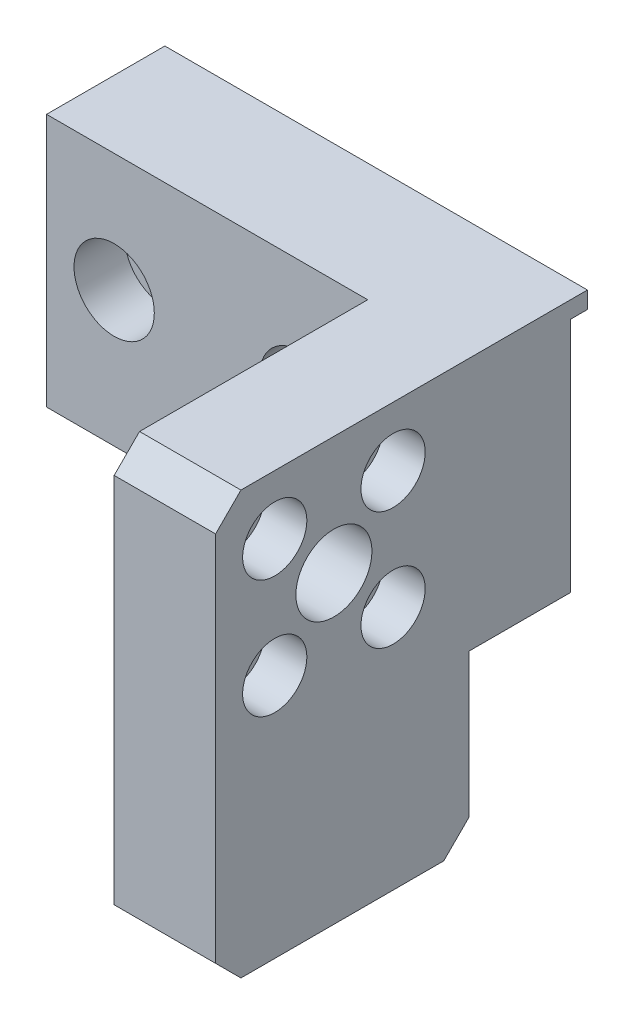
ISO-10303-21;
HEADER;
FILE_DESCRIPTION(('STEP AP214'),'2;1');
FILE_NAME('part.step','',(''),(''),'','','');
FILE_SCHEMA(('AUTOMOTIVE_DESIGN { 1 0 10303 214 1 1 1 1 }'));
ENDSEC;
DATA;
#1=APPLICATION_CONTEXT('core data for automotive mechanical design processes');
#2=APPLICATION_PROTOCOL_DEFINITION('international standard','automotive_design',2000,#1);
#3=PRODUCT_CONTEXT('',#1,'mechanical');
#4=PRODUCT('Part','Part','',(#3));
#5=PRODUCT_RELATED_PRODUCT_CATEGORY('part','',(#4));
#6=PRODUCT_DEFINITION_FORMATION('','',#4);
#7=PRODUCT_DEFINITION_CONTEXT('part definition',#1,'design');
#8=PRODUCT_DEFINITION('design','',#6,#7);
#9=PRODUCT_DEFINITION_SHAPE('','',#8);
#10=(LENGTH_UNIT() NAMED_UNIT(*) SI_UNIT(.MILLI.,.METRE.));
#11=(NAMED_UNIT(*) PLANE_ANGLE_UNIT() SI_UNIT($,.RADIAN.));
#12=(NAMED_UNIT(*) SI_UNIT($,.STERADIAN.) SOLID_ANGLE_UNIT());
#13=UNCERTAINTY_MEASURE_WITH_UNIT(LENGTH_MEASURE(1.E-05),#10,'distance_accuracy_value','');
#14=(GEOMETRIC_REPRESENTATION_CONTEXT(3) GLOBAL_UNCERTAINTY_ASSIGNED_CONTEXT((#13)) GLOBAL_UNIT_ASSIGNED_CONTEXT((#10,
#11,#12)) REPRESENTATION_CONTEXT('',''));
#15=CARTESIAN_POINT('',(0.,0.,0.));
#16=DIRECTION('',(0.,0.,1.));
#17=DIRECTION('',(1.,0.,0.));
#18=AXIS2_PLACEMENT_3D('',#15,#16,#17);
#19=CARTESIAN_POINT('',(13.,15.,44.));
#20=DIRECTION('',(1.,0.,0.));
#21=DIRECTION('',(0.,0.,-1.));
#22=AXIS2_PLACEMENT_3D('',#19,#20,#21);
#23=PLANE('',#22);
#24=CARTESIAN_POINT('',(13.,8.,23.));
#25=DIRECTION('',(1.,0.,0.));
#26=DIRECTION('',(0.,0.,-1.));
#27=AXIS2_PLACEMENT_3D('',#24,#25,#26);
#28=CIRCLE('',#27,2.25000000000001);
#29=CARTESIAN_POINT('',(13.,8.,20.75));
#30=VERTEX_POINT('',#29);
#31=EDGE_CURVE('E194',#30,#30,#28,.T.);
#32=ORIENTED_EDGE('',*,*,#31,.T.);
#33=EDGE_LOOP('',(#32));
#34=FACE_BOUND('',#33,.T.);
#35=CARTESIAN_POINT('',(13.,8.,37.));
#36=DIRECTION('',(1.,0.,0.));
#37=DIRECTION('',(0.,0.,-1.));
#38=AXIS2_PLACEMENT_3D('',#35,#36,#37);
#39=CIRCLE('',#38,2.25000000000001);
#40=CARTESIAN_POINT('',(13.,8.,34.75));
#41=VERTEX_POINT('',#40);
#42=EDGE_CURVE('E189',#41,#41,#39,.T.);
#43=ORIENTED_EDGE('',*,*,#42,.T.);
#44=EDGE_LOOP('',(#43));
#45=FACE_BOUND('',#44,.T.);
#46=CARTESIAN_POINT('',(13.,-6.,23.));
#47=DIRECTION('',(1.,0.,0.));
#48=DIRECTION('',(0.,0.,-1.));
#49=AXIS2_PLACEMENT_3D('',#46,#47,#48);
#50=CIRCLE('',#49,2.25000000000001);
#51=CARTESIAN_POINT('',(13.,-6.,20.75));
#52=VERTEX_POINT('',#51);
#53=EDGE_CURVE('E184',#52,#52,#50,.T.);
#54=ORIENTED_EDGE('',*,*,#53,.T.);
#55=EDGE_LOOP('',(#54));
#56=FACE_BOUND('',#55,.T.);
#57=CARTESIAN_POINT('',(13.,-6.,37.));
#58=DIRECTION('',(1.,0.,0.));
#59=DIRECTION('',(0.,0.,-1.));
#60=AXIS2_PLACEMENT_3D('',#57,#58,#59);
#61=CIRCLE('',#60,2.25000000000001);
#62=CARTESIAN_POINT('',(13.,-6.,34.75));
#63=VERTEX_POINT('',#62);
#64=EDGE_CURVE('E180',#63,#63,#61,.T.);
#65=ORIENTED_EDGE('',*,*,#64,.T.);
#66=EDGE_LOOP('',(#65));
#67=FACE_BOUND('',#66,.T.);
#68=DIRECTION('',(0.,1.,0.));
#69=VECTOR('',#68,1.);
#70=CARTESIAN_POINT('',(13.,-35.,14.));
#71=LINE('',#70,#69);
#72=CARTESIAN_POINT('',(13.,-32.,14.));
#73=VERTEX_POINT('',#72);
#74=CARTESIAN_POINT('',(13.,-15.,14.));
#75=VERTEX_POINT('',#74);
#76=EDGE_CURVE('E216',#73,#75,#71,.T.);
#77=ORIENTED_EDGE('',*,*,#76,.F.);
#78=DIRECTION('',(0.,-0.707106781186549,0.707106781186546));
#79=VECTOR('',#78,1.);
#80=CARTESIAN_POINT('',(13.,-35.,17.));
#81=LINE('',#80,#79);
#82=CARTESIAN_POINT('',(13.,-35.,17.));
#83=VERTEX_POINT('',#82);
#84=EDGE_CURVE('E316',#73,#83,#81,.T.);
#85=ORIENTED_EDGE('',*,*,#84,.T.);
#86=DIRECTION('',(0.,0.,-1.));
#87=VECTOR('',#86,1.);
#88=CARTESIAN_POINT('',(13.,-35.,44.));
#89=LINE('',#88,#87);
#90=CARTESIAN_POINT('',(13.,-35.,41.));
#91=VERTEX_POINT('',#90);
#92=EDGE_CURVE('E207',#91,#83,#89,.T.);
#93=ORIENTED_EDGE('',*,*,#92,.F.);
#94=DIRECTION('',(0.,0.707106781186549,0.707106781186546));
#95=VECTOR('',#94,1.);
#96=CARTESIAN_POINT('',(13.,-35.,41.));
#97=LINE('',#96,#95);
#98=CARTESIAN_POINT('',(13.,-32.,44.));
#99=VERTEX_POINT('',#98);
#100=EDGE_CURVE('E314',#91,#99,#97,.T.);
#101=ORIENTED_EDGE('',*,*,#100,.T.);
#102=DIRECTION('',(0.,-1.,0.));
#103=VECTOR('',#102,1.);
#104=CARTESIAN_POINT('',(13.,15.,44.));
#105=LINE('',#104,#103);
#106=CARTESIAN_POINT('',(13.,12.,44.));
#107=VERTEX_POINT('',#106);
#108=EDGE_CURVE('E165',#107,#99,#105,.T.);
#109=ORIENTED_EDGE('',*,*,#108,.F.);
#110=DIRECTION('',(0.,-0.707106781186548,0.707106781186547));
#111=VECTOR('',#110,1.);
#112=CARTESIAN_POINT('',(13.,15.,41.));
#113=LINE('',#112,#111);
#114=CARTESIAN_POINT('',(13.,15.,41.));
#115=VERTEX_POINT('',#114);
#116=EDGE_CURVE('E56',#107,#115,#113,.F.);
#117=ORIENTED_EDGE('',*,*,#116,.T.);
#118=DIRECTION('',(0.,0.,1.));
#119=VECTOR('',#118,1.);
#120=CARTESIAN_POINT('',(13.,15.,44.));
#121=LINE('',#120,#119);
#122=CARTESIAN_POINT('',(13.,15.,14.));
#123=VERTEX_POINT('',#122);
#124=EDGE_CURVE('E277',#123,#115,#121,.T.);
#125=ORIENTED_EDGE('',*,*,#124,.F.);
#126=DIRECTION('',(0.,-1.,0.));
#127=VECTOR('',#126,1.);
#128=CARTESIAN_POINT('',(13.,15.,14.));
#129=LINE('',#128,#127);
#130=EDGE_CURVE('E168',#123,#75,#129,.T.);
#131=ORIENTED_EDGE('',*,*,#130,.T.);
#132=EDGE_LOOP('',(#77,#85,#93,#101,#109,#117,#125,#131));
#133=FACE_BOUND('',#132,.T.);
#134=CARTESIAN_POINT('',(13.,0.999999999999999,30.));
#135=DIRECTION('',(1.,0.,0.));
#136=DIRECTION('',(0.,0.,-1.));
#137=AXIS2_PLACEMENT_3D('',#134,#135,#136);
#138=CIRCLE('',#137,6.);
#139=CARTESIAN_POINT('',(13.,0.999999999999999,24.));
#140=VERTEX_POINT('',#139);
#141=EDGE_CURVE('E178',#140,#140,#138,.T.);
#142=ORIENTED_EDGE('',*,*,#141,.T.);
#143=EDGE_LOOP('',(#142));
#144=FACE_BOUND('',#143,.T.);
#145=ADVANCED_FACE('F32',(#34,#45,#56,#67,#133,#144),#23,.F.);
#146=CARTESIAN_POINT('',(-25.,15.,14.));
#147=DIRECTION('',(1.,0.,0.));
#148=DIRECTION('',(0.,0.,-1.));
#149=AXIS2_PLACEMENT_3D('',#146,#147,#148);
#150=PLANE('',#149);
#151=DIRECTION('',(0.,0.,1.));
#152=VECTOR('',#151,1.);
#153=CARTESIAN_POINT('',(-25.,13.,0.));
#154=LINE('',#153,#152);
#155=CARTESIAN_POINT('',(-25.,13.,0.));
#156=VERTEX_POINT('',#155);
#157=CARTESIAN_POINT('',(-25.,13.,2.));
#158=VERTEX_POINT('',#157);
#159=EDGE_CURVE('E126',#156,#158,#154,.T.);
#160=ORIENTED_EDGE('',*,*,#159,.T.);
#161=DIRECTION('',(0.,-1.,0.));
#162=VECTOR('',#161,1.);
#163=CARTESIAN_POINT('',(-25.,-15.,2.));
#164=LINE('',#163,#162);
#165=CARTESIAN_POINT('',(-25.,-15.,2.));
#166=VERTEX_POINT('',#165);
#167=EDGE_CURVE('E137',#158,#166,#164,.T.);
#168=ORIENTED_EDGE('',*,*,#167,.T.);
#169=DIRECTION('',(0.,0.,1.));
#170=VECTOR('',#169,1.);
#171=CARTESIAN_POINT('',(-25.,-15.,14.));
#172=LINE('',#171,#170);
#173=CARTESIAN_POINT('',(-25.,-15.,14.));
#174=VERTEX_POINT('',#173);
#175=EDGE_CURVE('E271',#166,#174,#172,.T.);
#176=ORIENTED_EDGE('',*,*,#175,.T.);
#177=DIRECTION('',(0.,-1.,0.));
#178=VECTOR('',#177,1.);
#179=CARTESIAN_POINT('',(-25.,15.,14.));
#180=LINE('',#179,#178);
#181=CARTESIAN_POINT('',(-25.,15.,14.));
#182=VERTEX_POINT('',#181);
#183=EDGE_CURVE('E171',#182,#174,#180,.T.);
#184=ORIENTED_EDGE('',*,*,#183,.F.);
#185=DIRECTION('',(0.,0.,1.));
#186=VECTOR('',#185,1.);
#187=CARTESIAN_POINT('',(-25.,15.,14.));
#188=LINE('',#187,#186);
#189=CARTESIAN_POINT('',(-25.,15.,0.));
#190=VERTEX_POINT('',#189);
#191=EDGE_CURVE('E152',#190,#182,#188,.T.);
#192=ORIENTED_EDGE('',*,*,#191,.F.);
#193=DIRECTION('',(0.,-1.,0.));
#194=VECTOR('',#193,1.);
#195=CARTESIAN_POINT('',(-25.,15.,0.));
#196=LINE('',#195,#194);
#197=EDGE_CURVE('E144',#190,#156,#196,.T.);
#198=ORIENTED_EDGE('',*,*,#197,.T.);
#199=EDGE_LOOP('',(#160,#168,#176,#184,#192,#198));
#200=FACE_BOUND('',#199,.T.);
#201=ADVANCED_FACE('F149',(#200),#150,.F.);
#202=CARTESIAN_POINT('',(13.,15.,14.));
#203=DIRECTION('',(0.,0.,-1.));
#204=DIRECTION('',(-1.,0.,0.));
#205=AXIS2_PLACEMENT_3D('',#202,#203,#204);
#206=PLANE('',#205);
#207=CARTESIAN_POINT('',(5.,0.999999999999997,14.));
#208=DIRECTION('',(0.,0.,1.));
#209=DIRECTION('',(1.,0.,0.));
#210=AXIS2_PLACEMENT_3D('',#207,#208,#209);
#211=CIRCLE('',#210,4.75000000000001);
#212=CARTESIAN_POINT('',(9.75000000000002,0.999999999999997,14.));
#213=VERTEX_POINT('',#212);
#214=EDGE_CURVE('E218',#213,#213,#211,.T.);
#215=ORIENTED_EDGE('',*,*,#214,.F.);
#216=EDGE_LOOP('',(#215));
#217=FACE_BOUND('',#216,.T.);
#218=CARTESIAN_POINT('',(-17.,0.999999999999995,14.));
#219=DIRECTION('',(0.,0.,1.));
#220=DIRECTION('',(1.,0.,0.));
#221=AXIS2_PLACEMENT_3D('',#218,#219,#220);
#222=CIRCLE('',#221,4.75000000000001);
#223=CARTESIAN_POINT('',(-12.25,0.999999999999995,14.));
#224=VERTEX_POINT('',#223);
#225=EDGE_CURVE('E228',#224,#224,#222,.T.);
#226=ORIENTED_EDGE('',*,*,#225,.F.);
#227=EDGE_LOOP('',(#226));
#228=FACE_BOUND('',#227,.T.);
#229=DIRECTION('',(1.,0.,0.));
#230=VECTOR('',#229,1.);
#231=CARTESIAN_POINT('',(13.,-15.,14.));
#232=LINE('',#231,#230);
#233=EDGE_CURVE('E202',#174,#75,#232,.T.);
#234=ORIENTED_EDGE('',*,*,#233,.T.);
#235=ORIENTED_EDGE('',*,*,#130,.F.);
#236=DIRECTION('',(1.,0.,0.));
#237=VECTOR('',#236,1.);
#238=CARTESIAN_POINT('',(13.,15.,14.));
#239=LINE('',#238,#237);
#240=EDGE_CURVE('E275',#182,#123,#239,.T.);
#241=ORIENTED_EDGE('',*,*,#240,.F.);
#242=ORIENTED_EDGE('',*,*,#183,.T.);
#243=EDGE_LOOP('',(#234,#235,#241,#242));
#244=FACE_BOUND('',#243,.T.);
#245=ADVANCED_FACE('F284',(#217,#228,#244),#206,.F.);
#246=CARTESIAN_POINT('',(25.,15.,44.));
#247=DIRECTION('',(0.,0.,-1.));
#248=DIRECTION('',(-1.,0.,0.));
#249=AXIS2_PLACEMENT_3D('',#246,#247,#248);
#250=PLANE('',#249);
#251=ORIENTED_EDGE('',*,*,#108,.T.);
#252=DIRECTION('',(1.,0.,0.));
#253=VECTOR('',#252,1.);
#254=CARTESIAN_POINT('',(25.,-32.,44.));
#255=LINE('',#254,#253);
#256=CARTESIAN_POINT('',(25.,-32.,44.));
#257=VERTEX_POINT('',#256);
#258=EDGE_CURVE('E41',#99,#257,#255,.T.);
#259=ORIENTED_EDGE('',*,*,#258,.T.);
#260=DIRECTION('',(0.,-1.,0.));
#261=VECTOR('',#260,1.);
#262=CARTESIAN_POINT('',(25.,15.,44.));
#263=LINE('',#262,#261);
#264=CARTESIAN_POINT('',(25.,12.,44.));
#265=VERTEX_POINT('',#264);
#266=EDGE_CURVE('E155',#265,#257,#263,.T.);
#267=ORIENTED_EDGE('',*,*,#266,.F.);
#268=DIRECTION('',(-1.,0.,0.));
#269=VECTOR('',#268,1.);
#270=CARTESIAN_POINT('',(25.,12.,44.));
#271=LINE('',#270,#269);
#272=EDGE_CURVE('E298',#265,#107,#271,.T.);
#273=ORIENTED_EDGE('',*,*,#272,.T.);
#274=EDGE_LOOP('',(#251,#259,#267,#273));
#275=FACE_BOUND('',#274,.T.);
#276=ADVANCED_FACE('F321',(#275),#250,.F.);
#277=CARTESIAN_POINT('',(25.,15.,0.));
#278=DIRECTION('',(-1.,0.,0.));
#279=DIRECTION('',(0.,0.,1.));
#280=AXIS2_PLACEMENT_3D('',#277,#278,#279);
#281=PLANE('',#280);
#282=CARTESIAN_POINT('',(25.,8.,23.));
#283=DIRECTION('',(1.,0.,0.));
#284=DIRECTION('',(0.,0.,-1.));
#285=AXIS2_PLACEMENT_3D('',#282,#283,#284);
#286=CIRCLE('',#285,3.80000000000002);
#287=CARTESIAN_POINT('',(25.,8.,19.2));
#288=VERTEX_POINT('',#287);
#289=EDGE_CURVE('E237',#288,#288,#286,.T.);
#290=ORIENTED_EDGE('',*,*,#289,.F.);
#291=EDGE_LOOP('',(#290));
#292=FACE_BOUND('',#291,.T.);
#293=CARTESIAN_POINT('',(25.,8.,37.));
#294=DIRECTION('',(1.,0.,0.));
#295=DIRECTION('',(0.,0.,-1.));
#296=AXIS2_PLACEMENT_3D('',#293,#294,#295);
#297=CIRCLE('',#296,3.80000000000002);
#298=CARTESIAN_POINT('',(25.,8.,33.2));
#299=VERTEX_POINT('',#298);
#300=EDGE_CURVE('E197',#299,#299,#297,.T.);
#301=ORIENTED_EDGE('',*,*,#300,.F.);
#302=EDGE_LOOP('',(#301));
#303=FACE_BOUND('',#302,.T.);
#304=CARTESIAN_POINT('',(25.,-6.,23.));
#305=DIRECTION('',(1.,0.,0.));
#306=DIRECTION('',(0.,0.,-1.));
#307=AXIS2_PLACEMENT_3D('',#304,#305,#306);
#308=CIRCLE('',#307,3.80000000000002);
#309=CARTESIAN_POINT('',(25.,-6.,19.2));
#310=VERTEX_POINT('',#309);
#311=EDGE_CURVE('E192',#310,#310,#308,.T.);
#312=ORIENTED_EDGE('',*,*,#311,.F.);
#313=EDGE_LOOP('',(#312));
#314=FACE_BOUND('',#313,.T.);
#315=CARTESIAN_POINT('',(25.,-6.,37.));
#316=DIRECTION('',(1.,0.,0.));
#317=DIRECTION('',(0.,0.,-1.));
#318=AXIS2_PLACEMENT_3D('',#315,#316,#317);
#319=CIRCLE('',#318,3.80000000000002);
#320=CARTESIAN_POINT('',(25.,-6.,33.2));
#321=VERTEX_POINT('',#320);
#322=EDGE_CURVE('E187',#321,#321,#319,.T.);
#323=ORIENTED_EDGE('',*,*,#322,.F.);
#324=EDGE_LOOP('',(#323));
#325=FACE_BOUND('',#324,.T.);
#326=CARTESIAN_POINT('',(25.,0.999999999999999,30.));
#327=DIRECTION('',(1.,0.,0.));
#328=DIRECTION('',(0.,0.,-1.));
#329=AXIS2_PLACEMENT_3D('',#326,#327,#328);
#330=CIRCLE('',#329,4.5);
#331=CARTESIAN_POINT('',(25.,0.999999999999999,25.5));
#332=VERTEX_POINT('',#331);
#333=EDGE_CURVE('E179',#332,#332,#330,.T.);
#334=ORIENTED_EDGE('',*,*,#333,.F.);
#335=EDGE_LOOP('',(#334));
#336=FACE_BOUND('',#335,.T.);
#337=DIRECTION('',(0.,0.,-1.));
#338=VECTOR('',#337,1.);
#339=CARTESIAN_POINT('',(25.,-15.,0.));
#340=LINE('',#339,#338);
#341=CARTESIAN_POINT('',(25.,-15.,14.));
#342=VERTEX_POINT('',#341);
#343=CARTESIAN_POINT('',(25.,-15.,1.99999999999999));
#344=VERTEX_POINT('',#343);
#345=EDGE_CURVE('E199',#342,#344,#340,.T.);
#346=ORIENTED_EDGE('',*,*,#345,.T.);
#347=DIRECTION('',(0.,-1.,0.));
#348=VECTOR('',#347,1.);
#349=CARTESIAN_POINT('',(25.,-15.,1.99999999999999));
#350=LINE('',#349,#348);
#351=CARTESIAN_POINT('',(25.,13.,1.99999999999999));
#352=VERTEX_POINT('',#351);
#353=EDGE_CURVE('E48',#352,#344,#350,.T.);
#354=ORIENTED_EDGE('',*,*,#353,.F.);
#355=DIRECTION('',(0.,0.,1.));
#356=VECTOR('',#355,1.);
#357=CARTESIAN_POINT('',(25.,13.,0.));
#358=LINE('',#357,#356);
#359=CARTESIAN_POINT('',(25.,13.,0.));
#360=VERTEX_POINT('',#359);
#361=EDGE_CURVE('E342',#360,#352,#358,.T.);
#362=ORIENTED_EDGE('',*,*,#361,.F.);
#363=DIRECTION('',(0.,-1.,0.));
#364=VECTOR('',#363,1.);
#365=CARTESIAN_POINT('',(25.,15.,0.));
#366=LINE('',#365,#364);
#367=CARTESIAN_POINT('',(25.,15.,0.));
#368=VERTEX_POINT('',#367);
#369=EDGE_CURVE('E147',#368,#360,#366,.T.);
#370=ORIENTED_EDGE('',*,*,#369,.F.);
#371=DIRECTION('',(0.,0.,-1.));
#372=VECTOR('',#371,1.);
#373=CARTESIAN_POINT('',(25.,15.,0.));
#374=LINE('',#373,#372);
#375=CARTESIAN_POINT('',(25.,15.,41.));
#376=VERTEX_POINT('',#375);
#377=EDGE_CURVE('E157',#376,#368,#374,.T.);
#378=ORIENTED_EDGE('',*,*,#377,.F.);
#379=DIRECTION('',(0.,0.707106781186548,-0.707106781186547));
#380=VECTOR('',#379,1.);
#381=CARTESIAN_POINT('',(25.,15.,41.));
#382=LINE('',#381,#380);
#383=EDGE_CURVE('E297',#376,#265,#382,.F.);
#384=ORIENTED_EDGE('',*,*,#383,.T.);
#385=ORIENTED_EDGE('',*,*,#266,.T.);
#386=DIRECTION('',(0.,-0.707106781186549,-0.707106781186546));
#387=VECTOR('',#386,1.);
#388=CARTESIAN_POINT('',(25.,-35.,41.));
#389=LINE('',#388,#387);
#390=CARTESIAN_POINT('',(25.,-35.,41.));
#391=VERTEX_POINT('',#390);
#392=EDGE_CURVE('E301',#257,#391,#389,.T.);
#393=ORIENTED_EDGE('',*,*,#392,.T.);
#394=DIRECTION('',(0.,0.,1.));
#395=VECTOR('',#394,1.);
#396=CARTESIAN_POINT('',(25.,-35.,44.));
#397=LINE('',#396,#395);
#398=CARTESIAN_POINT('',(25.,-35.,17.));
#399=VERTEX_POINT('',#398);
#400=EDGE_CURVE('E214',#399,#391,#397,.T.);
#401=ORIENTED_EDGE('',*,*,#400,.F.);
#402=DIRECTION('',(0.,0.707106781186549,-0.707106781186546));
#403=VECTOR('',#402,1.);
#404=CARTESIAN_POINT('',(25.,-35.,17.));
#405=LINE('',#404,#403);
#406=CARTESIAN_POINT('',(25.,-32.,14.));
#407=VERTEX_POINT('',#406);
#408=EDGE_CURVE('E304',#399,#407,#405,.T.);
#409=ORIENTED_EDGE('',*,*,#408,.T.);
#410=DIRECTION('',(0.,1.,0.));
#411=VECTOR('',#410,1.);
#412=CARTESIAN_POINT('',(25.,-35.,14.));
#413=LINE('',#412,#411);
#414=EDGE_CURVE('E219',#407,#342,#413,.T.);
#415=ORIENTED_EDGE('',*,*,#414,.T.);
#416=EDGE_LOOP('',(#346,#354,#362,#370,#378,#384,#385,#393,#401,#409,#415));
#417=FACE_BOUND('',#416,.T.);
#418=ADVANCED_FACE('F324',(#292,#303,#314,#325,#336,#417),#281,.F.);
#419=CARTESIAN_POINT('',(-25.,15.,0.));
#420=DIRECTION('',(0.,0.,1.));
#421=DIRECTION('',(1.,0.,0.));
#422=AXIS2_PLACEMENT_3D('',#419,#420,#421);
#423=PLANE('',#422);
#424=ORIENTED_EDGE('',*,*,#369,.T.);
#425=DIRECTION('',(1.,0.,0.));
#426=VECTOR('',#425,1.);
#427=CARTESIAN_POINT('',(-25.,13.,0.));
#428=LINE('',#427,#426);
#429=EDGE_CURVE('E130',#156,#360,#428,.T.);
#430=ORIENTED_EDGE('',*,*,#429,.F.);
#431=ORIENTED_EDGE('',*,*,#197,.F.);
#432=DIRECTION('',(-1.,0.,0.));
#433=VECTOR('',#432,1.);
#434=CARTESIAN_POINT('',(-25.,15.,0.));
#435=LINE('',#434,#433);
#436=EDGE_CURVE('E153',#368,#190,#435,.T.);
#437=ORIENTED_EDGE('',*,*,#436,.F.);
#438=EDGE_LOOP('',(#424,#430,#431,#437));
#439=FACE_BOUND('',#438,.T.);
#440=ADVANCED_FACE('F142',(#439),#423,.F.);
#441=CARTESIAN_POINT('',(-25.,15.,0.));
#442=DIRECTION('',(0.,-1.,0.));
#443=DIRECTION('',(0.,0.,-1.));
#444=AXIS2_PLACEMENT_3D('',#441,#442,#443);
#445=PLANE('',#444);
#446=ORIENTED_EDGE('',*,*,#124,.T.);
#447=DIRECTION('',(1.,0.,0.));
#448=VECTOR('',#447,1.);
#449=CARTESIAN_POINT('',(-25.,15.,41.));
#450=LINE('',#449,#448);
#451=EDGE_CURVE('E11',#115,#376,#450,.T.);
#452=ORIENTED_EDGE('',*,*,#451,.T.);
#453=ORIENTED_EDGE('',*,*,#377,.T.);
#454=ORIENTED_EDGE('',*,*,#436,.T.);
#455=ORIENTED_EDGE('',*,*,#191,.T.);
#456=ORIENTED_EDGE('',*,*,#240,.T.);
#457=EDGE_LOOP('',(#446,#452,#453,#454,#455,#456));
#458=FACE_BOUND('',#457,.T.);
#459=ADVANCED_FACE('F293',(#458),#445,.F.);
#460=CARTESIAN_POINT('',(-25.,-15.,0.));
#461=DIRECTION('',(0.,-1.,0.));
#462=DIRECTION('',(0.,0.,-1.));
#463=AXIS2_PLACEMENT_3D('',#460,#461,#462);
#464=PLANE('',#463);
#465=DIRECTION('',(1.,0.,0.));
#466=VECTOR('',#465,1.);
#467=CARTESIAN_POINT('',(-25.,-15.,2.));
#468=LINE('',#467,#466);
#469=EDGE_CURVE('E339',#166,#344,#468,.T.);
#470=ORIENTED_EDGE('',*,*,#469,.T.);
#471=ORIENTED_EDGE('',*,*,#345,.F.);
#472=DIRECTION('',(1.,0.,0.));
#473=VECTOR('',#472,1.);
#474=CARTESIAN_POINT('',(13.,-15.,14.));
#475=LINE('',#474,#473);
#476=EDGE_CURVE('E203',#75,#342,#475,.T.);
#477=ORIENTED_EDGE('',*,*,#476,.F.);
#478=ORIENTED_EDGE('',*,*,#233,.F.);
#479=ORIENTED_EDGE('',*,*,#175,.F.);
#480=EDGE_LOOP('',(#470,#471,#477,#478,#479));
#481=FACE_BOUND('',#480,.T.);
#482=ADVANCED_FACE('F344',(#481),#464,.T.);
#483=CARTESIAN_POINT('',(17.,0.999999999999999,30.));
#484=DIRECTION('',(-1.,0.,0.));
#485=DIRECTION('',(0.,0.,1.));
#486=AXIS2_PLACEMENT_3D('',#483,#484,#485);
#487=CYLINDRICAL_SURFACE('',#486,6.);
#488=CARTESIAN_POINT('',(17.,0.999999999999999,30.));
#489=DIRECTION('',(1.,0.,0.));
#490=DIRECTION('',(0.,0.,-1.));
#491=AXIS2_PLACEMENT_3D('',#488,#489,#490);
#492=CIRCLE('',#491,6.);
#493=CARTESIAN_POINT('',(17.,0.999999999999999,24.));
#494=VERTEX_POINT('',#493);
#495=EDGE_CURVE('E268',#494,#494,#492,.T.);
#496=ORIENTED_EDGE('',*,*,#495,.T.);
#497=EDGE_LOOP('',(#496));
#498=FACE_BOUND('',#497,.T.);
#499=ORIENTED_EDGE('',*,*,#141,.F.);
#500=EDGE_LOOP('',(#499));
#501=FACE_BOUND('',#500,.T.);
#502=ADVANCED_FACE('F456',(#498,#501),#487,.F.);
#503=CARTESIAN_POINT('',(17.,0.999999999999999,30.));
#504=DIRECTION('',(1.,0.,0.));
#505=DIRECTION('',(0.,0.,-1.));
#506=AXIS2_PLACEMENT_3D('',#503,#504,#505);
#507=PLANE('',#506);
#508=CARTESIAN_POINT('',(17.,0.999999999999999,30.));
#509=DIRECTION('',(1.,0.,0.));
#510=DIRECTION('',(0.,0.,-1.));
#511=AXIS2_PLACEMENT_3D('',#508,#509,#510);
#512=CIRCLE('',#511,4.5);
#513=CARTESIAN_POINT('',(17.,0.999999999999999,25.5));
#514=VERTEX_POINT('',#513);
#515=EDGE_CURVE('E175',#514,#514,#512,.T.);
#516=ORIENTED_EDGE('',*,*,#515,.T.);
#517=EDGE_LOOP('',(#516));
#518=FACE_BOUND('',#517,.T.);
#519=ORIENTED_EDGE('',*,*,#495,.F.);
#520=EDGE_LOOP('',(#519));
#521=FACE_BOUND('',#520,.T.);
#522=ADVANCED_FACE('F452',(#518,#521),#507,.F.);
#523=CARTESIAN_POINT('',(-25.,0.999999999999999,30.));
#524=DIRECTION('',(1.,0.,0.));
#525=DIRECTION('',(0.,0.,-1.));
#526=AXIS2_PLACEMENT_3D('',#523,#524,#525);
#527=CYLINDRICAL_SURFACE('',#526,4.5);
#528=CARTESIAN_POINT('',(25.,0.999999999999999,25.5));
#529=CARTESIAN_POINT('',(24.9166666666667,0.999999999999999,25.5));
#530=CARTESIAN_POINT('',(24.8333333333333,0.999999999999999,25.5));
#531=CARTESIAN_POINT('',(24.6666666666667,0.999999999999999,25.5));
#532=CARTESIAN_POINT('',(24.5833333333333,0.999999999999999,25.5));
#533=CARTESIAN_POINT('',(24.4166666666667,0.999999999999999,25.5));
#534=CARTESIAN_POINT('',(24.3333333333333,0.999999999999999,25.5));
#535=CARTESIAN_POINT('',(24.1666666666667,0.999999999999999,25.5));
#536=CARTESIAN_POINT('',(24.0833333333333,0.999999999999999,25.5));
#537=CARTESIAN_POINT('',(23.9166666666667,0.999999999999999,25.5));
#538=CARTESIAN_POINT('',(23.8333333333333,0.999999999999999,25.5));
#539=CARTESIAN_POINT('',(23.6666666666667,0.999999999999999,25.5));
#540=CARTESIAN_POINT('',(23.5833333333333,0.999999999999999,25.5));
#541=CARTESIAN_POINT('',(23.4166666666667,0.999999999999999,25.5));
#542=CARTESIAN_POINT('',(23.3333333333333,0.999999999999999,25.5));
#543=CARTESIAN_POINT('',(23.1666666666667,0.999999999999999,25.5));
#544=CARTESIAN_POINT('',(23.0833333333333,0.999999999999999,25.5));
#545=CARTESIAN_POINT('',(22.9166666666667,0.999999999999999,25.5));
#546=CARTESIAN_POINT('',(22.8333333333333,0.999999999999999,25.5));
#547=CARTESIAN_POINT('',(22.6666666666667,0.999999999999999,25.5));
#548=CARTESIAN_POINT('',(22.5833333333333,0.999999999999999,25.5));
#549=CARTESIAN_POINT('',(22.4166666666667,0.999999999999999,25.5));
#550=CARTESIAN_POINT('',(22.3333333333333,0.999999999999999,25.5));
#551=CARTESIAN_POINT('',(22.1666666666667,0.999999999999999,25.5));
#552=CARTESIAN_POINT('',(22.0833333333333,0.999999999999999,25.5));
#553=CARTESIAN_POINT('',(21.9166666666667,0.999999999999999,25.5));
#554=CARTESIAN_POINT('',(21.8333333333333,0.999999999999999,25.5));
#555=CARTESIAN_POINT('',(21.6666666666667,0.999999999999999,25.5));
#556=CARTESIAN_POINT('',(21.5833333333333,0.999999999999999,25.5));
#557=CARTESIAN_POINT('',(21.4166666666667,0.999999999999999,25.5));
#558=CARTESIAN_POINT('',(21.3333333333333,0.999999999999999,25.5));
#559=CARTESIAN_POINT('',(21.1666666666667,0.999999999999999,25.5));
#560=CARTESIAN_POINT('',(21.0833333333333,0.999999999999999,25.5));
#561=CARTESIAN_POINT('',(20.9166666666667,0.999999999999999,25.5));
#562=CARTESIAN_POINT('',(20.8333333333333,0.999999999999999,25.5));
#563=CARTESIAN_POINT('',(20.6666666666667,0.999999999999999,25.5));
#564=CARTESIAN_POINT('',(20.5833333333333,0.999999999999999,25.5));
#565=CARTESIAN_POINT('',(20.4166666666667,0.999999999999999,25.5));
#566=CARTESIAN_POINT('',(20.3333333333333,0.999999999999999,25.5));
#567=CARTESIAN_POINT('',(20.1666666666667,0.999999999999999,25.5));
#568=CARTESIAN_POINT('',(20.0833333333333,0.999999999999999,25.5));
#569=CARTESIAN_POINT('',(19.9166666666667,0.999999999999999,25.5));
#570=CARTESIAN_POINT('',(19.8333333333333,0.999999999999999,25.5));
#571=CARTESIAN_POINT('',(19.6666666666667,0.999999999999999,25.5));
#572=CARTESIAN_POINT('',(19.5833333333333,0.999999999999999,25.5));
#573=CARTESIAN_POINT('',(19.4166666666667,0.999999999999999,25.5));
#574=CARTESIAN_POINT('',(19.3333333333333,0.999999999999999,25.5));
#575=CARTESIAN_POINT('',(19.1666666666667,0.999999999999999,25.5));
#576=CARTESIAN_POINT('',(19.0833333333333,0.999999999999999,25.5));
#577=CARTESIAN_POINT('',(18.9166666666667,0.999999999999999,25.5));
#578=CARTESIAN_POINT('',(18.8333333333333,0.999999999999999,25.5));
#579=CARTESIAN_POINT('',(18.6666666666667,0.999999999999999,25.5));
#580=CARTESIAN_POINT('',(18.5833333333333,0.999999999999999,25.5));
#581=CARTESIAN_POINT('',(18.4166666666667,0.999999999999999,25.5));
#582=CARTESIAN_POINT('',(18.3333333333333,0.999999999999999,25.5));
#583=CARTESIAN_POINT('',(18.1666666666667,0.999999999999999,25.5));
#584=CARTESIAN_POINT('',(18.0833333333333,0.999999999999999,25.5));
#585=CARTESIAN_POINT('',(17.9166666666667,0.999999999999999,25.5));
#586=CARTESIAN_POINT('',(17.8333333333333,0.999999999999999,25.5));
#587=CARTESIAN_POINT('',(17.6666666666667,0.999999999999999,25.5));
#588=CARTESIAN_POINT('',(17.5833333333333,0.999999999999999,25.5));
#589=CARTESIAN_POINT('',(17.4166666666667,0.999999999999999,25.5));
#590=CARTESIAN_POINT('',(17.3333333333333,0.999999999999999,25.5));
#591=CARTESIAN_POINT('',(17.1666666666667,0.999999999999999,25.5));
#592=CARTESIAN_POINT('',(17.0833333333333,0.999999999999999,25.5));
#593=CARTESIAN_POINT('',(17.,0.999999999999999,25.5));
#594=B_SPLINE_CURVE_WITH_KNOTS('',3,(#528,#529,#530,#531,#532,#533,#534,#535,#536,#537,#538,
#539,#540,#541,#542,#543,#544,#545,#546,#547,#548,#549,#550,#551,#552,#553,#554,#555,#556,#557,
#558,#559,#560,#561,#562,#563,#564,#565,#566,#567,#568,#569,#570,#571,#572,#573,#574,#575,#576,
#577,#578,#579,#580,#581,#582,#583,#584,#585,#586,#587,#588,#589,#590,#591,#592,#593),
.UNSPECIFIED.,.F.,.F.,(4,2,2,2,2,2,2,2,2,2,2,2,2,2,2,2,2,2,2,2,2,2,2,2,2,2,2,2,2,2,2,2,4),(0.,
0.25,0.5,0.750000000000001,1.,1.25,1.5,1.75,2.,2.25000000000001,2.50000000000001,
2.75000000000001,3.00000000000001,3.25000000000001,3.50000000000001,3.75000000000001,
4.00000000000001,4.25000000000001,4.50000000000001,4.75000000000001,5.00000000000001,
5.25000000000001,5.50000000000001,5.75000000000002,6.00000000000002,6.25000000000002,
6.50000000000002,6.75000000000002,7.00000000000002,7.25000000000002,7.50000000000002,
7.75000000000002,8.00000000000002),.UNSPECIFIED.);
#595=EDGE_CURVE('BSEAM448',#332,#514,#594,.T.);
#596=ORIENTED_EDGE('',*,*,#333,.T.);
#597=ORIENTED_EDGE('',*,*,#515,.F.);
#598=ORIENTED_EDGE('',*,*,#595,.T.);
#599=ORIENTED_EDGE('',*,*,#595,.F.);
#600=EDGE_LOOP('',(#596,#598,#597,#599));
#601=FACE_BOUND('',#600,.T.);
#602=ADVANCED_FACE('F448',(#601),#527,.F.);
#603=CARTESIAN_POINT('',(25.,-6.,37.));
#604=DIRECTION('',(1.,0.,0.));
#605=DIRECTION('',(0.,0.,-1.));
#606=AXIS2_PLACEMENT_3D('',#603,#604,#605);
#607=CYLINDRICAL_SURFACE('',#606,2.25000000000001);
#608=CARTESIAN_POINT('',(20.,-6.,37.));
#609=DIRECTION('',(1.,0.,0.));
#610=DIRECTION('',(0.,0.,-1.));
#611=AXIS2_PLACEMENT_3D('',#608,#609,#610);
#612=CIRCLE('',#611,2.25000000000001);
#613=CARTESIAN_POINT('',(20.,-6.,34.75));
#614=VERTEX_POINT('',#613);
#615=EDGE_CURVE('E183',#614,#614,#612,.T.);
#616=ORIENTED_EDGE('',*,*,#615,.T.);
#617=EDGE_LOOP('',(#616));
#618=FACE_BOUND('',#617,.T.);
#619=ORIENTED_EDGE('',*,*,#64,.F.);
#620=EDGE_LOOP('',(#619));
#621=FACE_BOUND('',#620,.T.);
#622=ADVANCED_FACE('F444',(#618,#621),#607,.F.);
#623=CARTESIAN_POINT('',(20.,-3.74999999999999,37.));
#624=DIRECTION('',(-1.,0.,0.));
#625=DIRECTION('',(0.,0.,1.));
#626=AXIS2_PLACEMENT_3D('',#623,#624,#625);
#627=PLANE('',#626);
#628=ORIENTED_EDGE('',*,*,#615,.F.);
#629=EDGE_LOOP('',(#628));
#630=FACE_BOUND('',#629,.T.);
#631=CARTESIAN_POINT('',(20.,-6.,37.));
#632=DIRECTION('',(1.,0.,0.));
#633=DIRECTION('',(0.,0.,-1.));
#634=AXIS2_PLACEMENT_3D('',#631,#632,#633);
#635=CIRCLE('',#634,3.80000000000001);
#636=CARTESIAN_POINT('',(20.,-6.,33.2));
#637=VERTEX_POINT('',#636);
#638=EDGE_CURVE('E261',#637,#637,#635,.T.);
#639=ORIENTED_EDGE('',*,*,#638,.T.);
#640=EDGE_LOOP('',(#639));
#641=FACE_BOUND('',#640,.T.);
#642=ADVANCED_FACE('F440',(#630,#641),#627,.F.);
#643=CARTESIAN_POINT('',(25.,-6.,37.));
#644=DIRECTION('',(1.,0.,0.));
#645=DIRECTION('',(0.,0.,-1.));
#646=AXIS2_PLACEMENT_3D('',#643,#644,#645);
#647=CYLINDRICAL_SURFACE('',#646,3.80000000000001);
#648=ORIENTED_EDGE('',*,*,#638,.F.);
#649=EDGE_LOOP('',(#648));
#650=FACE_BOUND('',#649,.T.);
#651=ORIENTED_EDGE('',*,*,#322,.T.);
#652=EDGE_LOOP('',(#651));
#653=FACE_BOUND('',#652,.T.);
#654=ADVANCED_FACE('F436',(#650,#653),#647,.F.);
#655=CARTESIAN_POINT('',(25.,-6.,23.));
#656=DIRECTION('',(1.,0.,0.));
#657=DIRECTION('',(0.,0.,-1.));
#658=AXIS2_PLACEMENT_3D('',#655,#656,#657);
#659=CYLINDRICAL_SURFACE('',#658,2.25000000000001);
#660=CARTESIAN_POINT('',(20.,-6.,23.));
#661=DIRECTION('',(1.,0.,0.));
#662=DIRECTION('',(0.,0.,-1.));
#663=AXIS2_PLACEMENT_3D('',#660,#661,#662);
#664=CIRCLE('',#663,2.25000000000001);
#665=CARTESIAN_POINT('',(20.,-6.,20.75));
#666=VERTEX_POINT('',#665);
#667=EDGE_CURVE('E188',#666,#666,#664,.T.);
#668=ORIENTED_EDGE('',*,*,#667,.T.);
#669=EDGE_LOOP('',(#668));
#670=FACE_BOUND('',#669,.T.);
#671=ORIENTED_EDGE('',*,*,#53,.F.);
#672=EDGE_LOOP('',(#671));
#673=FACE_BOUND('',#672,.T.);
#674=ADVANCED_FACE('F432',(#670,#673),#659,.F.);
#675=CARTESIAN_POINT('',(20.,-3.74999999999999,23.));
#676=DIRECTION('',(-1.,0.,0.));
#677=DIRECTION('',(0.,0.,1.));
#678=AXIS2_PLACEMENT_3D('',#675,#676,#677);
#679=PLANE('',#678);
#680=ORIENTED_EDGE('',*,*,#667,.F.);
#681=EDGE_LOOP('',(#680));
#682=FACE_BOUND('',#681,.T.);
#683=CARTESIAN_POINT('',(20.,-6.,23.));
#684=DIRECTION('',(1.,0.,0.));
#685=DIRECTION('',(0.,0.,-1.));
#686=AXIS2_PLACEMENT_3D('',#683,#684,#685);
#687=CIRCLE('',#686,3.80000000000001);
#688=CARTESIAN_POINT('',(20.,-6.,19.2));
#689=VERTEX_POINT('',#688);
#690=EDGE_CURVE('E254',#689,#689,#687,.T.);
#691=ORIENTED_EDGE('',*,*,#690,.T.);
#692=EDGE_LOOP('',(#691));
#693=FACE_BOUND('',#692,.T.);
#694=ADVANCED_FACE('F428',(#682,#693),#679,.F.);
#695=CARTESIAN_POINT('',(25.,-6.,23.));
#696=DIRECTION('',(1.,0.,0.));
#697=DIRECTION('',(0.,0.,-1.));
#698=AXIS2_PLACEMENT_3D('',#695,#696,#697);
#699=CYLINDRICAL_SURFACE('',#698,3.80000000000001);
#700=ORIENTED_EDGE('',*,*,#690,.F.);
#701=EDGE_LOOP('',(#700));
#702=FACE_BOUND('',#701,.T.);
#703=ORIENTED_EDGE('',*,*,#311,.T.);
#704=EDGE_LOOP('',(#703));
#705=FACE_BOUND('',#704,.T.);
#706=ADVANCED_FACE('F424',(#702,#705),#699,.F.);
#707=CARTESIAN_POINT('',(25.,8.,37.));
#708=DIRECTION('',(1.,0.,0.));
#709=DIRECTION('',(0.,0.,-1.));
#710=AXIS2_PLACEMENT_3D('',#707,#708,#709);
#711=CYLINDRICAL_SURFACE('',#710,2.25000000000001);
#712=CARTESIAN_POINT('',(20.,8.,37.));
#713=DIRECTION('',(1.,0.,0.));
#714=DIRECTION('',(0.,0.,-1.));
#715=AXIS2_PLACEMENT_3D('',#712,#713,#714);
#716=CIRCLE('',#715,2.25000000000001);
#717=CARTESIAN_POINT('',(20.,8.,34.75));
#718=VERTEX_POINT('',#717);
#719=EDGE_CURVE('E193',#718,#718,#716,.T.);
#720=ORIENTED_EDGE('',*,*,#719,.T.);
#721=EDGE_LOOP('',(#720));
#722=FACE_BOUND('',#721,.T.);
#723=ORIENTED_EDGE('',*,*,#42,.F.);
#724=EDGE_LOOP('',(#723));
#725=FACE_BOUND('',#724,.T.);
#726=ADVANCED_FACE('F420',(#722,#725),#711,.F.);
#727=CARTESIAN_POINT('',(20.,10.25,37.));
#728=DIRECTION('',(-1.,0.,0.));
#729=DIRECTION('',(0.,0.,1.));
#730=AXIS2_PLACEMENT_3D('',#727,#728,#729);
#731=PLANE('',#730);
#732=ORIENTED_EDGE('',*,*,#719,.F.);
#733=EDGE_LOOP('',(#732));
#734=FACE_BOUND('',#733,.T.);
#735=CARTESIAN_POINT('',(20.,8.,37.));
#736=DIRECTION('',(1.,0.,0.));
#737=DIRECTION('',(0.,0.,-1.));
#738=AXIS2_PLACEMENT_3D('',#735,#736,#737);
#739=CIRCLE('',#738,3.80000000000001);
#740=CARTESIAN_POINT('',(20.,8.,33.2));
#741=VERTEX_POINT('',#740);
#742=EDGE_CURVE('E247',#741,#741,#739,.T.);
#743=ORIENTED_EDGE('',*,*,#742,.T.);
#744=EDGE_LOOP('',(#743));
#745=FACE_BOUND('',#744,.T.);
#746=ADVANCED_FACE('F416',(#734,#745),#731,.F.);
#747=CARTESIAN_POINT('',(25.,8.,37.));
#748=DIRECTION('',(1.,0.,0.));
#749=DIRECTION('',(0.,0.,-1.));
#750=AXIS2_PLACEMENT_3D('',#747,#748,#749);
#751=CYLINDRICAL_SURFACE('',#750,3.80000000000001);
#752=ORIENTED_EDGE('',*,*,#742,.F.);
#753=EDGE_LOOP('',(#752));
#754=FACE_BOUND('',#753,.T.);
#755=ORIENTED_EDGE('',*,*,#300,.T.);
#756=EDGE_LOOP('',(#755));
#757=FACE_BOUND('',#756,.T.);
#758=ADVANCED_FACE('F412',(#754,#757),#751,.F.);
#759=CARTESIAN_POINT('',(25.,8.,23.));
#760=DIRECTION('',(1.,0.,0.));
#761=DIRECTION('',(0.,0.,-1.));
#762=AXIS2_PLACEMENT_3D('',#759,#760,#761);
#763=CYLINDRICAL_SURFACE('',#762,2.25000000000001);
#764=CARTESIAN_POINT('',(20.,8.,23.));
#765=DIRECTION('',(1.,0.,0.));
#766=DIRECTION('',(0.,0.,-1.));
#767=AXIS2_PLACEMENT_3D('',#764,#765,#766);
#768=CIRCLE('',#767,2.25000000000001);
#769=CARTESIAN_POINT('',(20.,8.,20.75));
#770=VERTEX_POINT('',#769);
#771=EDGE_CURVE('E198',#770,#770,#768,.T.);
#772=ORIENTED_EDGE('',*,*,#771,.T.);
#773=EDGE_LOOP('',(#772));
#774=FACE_BOUND('',#773,.T.);
#775=ORIENTED_EDGE('',*,*,#31,.F.);
#776=EDGE_LOOP('',(#775));
#777=FACE_BOUND('',#776,.T.);
#778=ADVANCED_FACE('F408',(#774,#777),#763,.F.);
#779=CARTESIAN_POINT('',(20.,10.25,23.));
#780=DIRECTION('',(-1.,0.,0.));
#781=DIRECTION('',(0.,0.,1.));
#782=AXIS2_PLACEMENT_3D('',#779,#780,#781);
#783=PLANE('',#782);
#784=ORIENTED_EDGE('',*,*,#771,.F.);
#785=EDGE_LOOP('',(#784));
#786=FACE_BOUND('',#785,.T.);
#787=CARTESIAN_POINT('',(20.,8.,23.));
#788=DIRECTION('',(1.,0.,0.));
#789=DIRECTION('',(0.,0.,-1.));
#790=AXIS2_PLACEMENT_3D('',#787,#788,#789);
#791=CIRCLE('',#790,3.80000000000001);
#792=CARTESIAN_POINT('',(20.,8.,19.2));
#793=VERTEX_POINT('',#792);
#794=EDGE_CURVE('E240',#793,#793,#791,.T.);
#795=ORIENTED_EDGE('',*,*,#794,.T.);
#796=EDGE_LOOP('',(#795));
#797=FACE_BOUND('',#796,.T.);
#798=ADVANCED_FACE('F404',(#786,#797),#783,.F.);
#799=CARTESIAN_POINT('',(25.,8.,23.));
#800=DIRECTION('',(1.,0.,0.));
#801=DIRECTION('',(0.,0.,-1.));
#802=AXIS2_PLACEMENT_3D('',#799,#800,#801);
#803=CYLINDRICAL_SURFACE('',#802,3.80000000000001);
#804=ORIENTED_EDGE('',*,*,#794,.F.);
#805=EDGE_LOOP('',(#804));
#806=FACE_BOUND('',#805,.T.);
#807=ORIENTED_EDGE('',*,*,#289,.T.);
#808=EDGE_LOOP('',(#807));
#809=FACE_BOUND('',#808,.T.);
#810=ADVANCED_FACE('F400',(#806,#809),#803,.F.);
#811=CARTESIAN_POINT('',(-17.,0.999999999999995,14.));
#812=DIRECTION('',(0.,0.,1.));
#813=DIRECTION('',(1.,0.,0.));
#814=AXIS2_PLACEMENT_3D('',#811,#812,#813);
#815=CYLINDRICAL_SURFACE('',#814,2.75000000000001);
#816=CARTESIAN_POINT('',(-17.,0.999999999999995,2.));
#817=DIRECTION('',(0.,0.,1.));
#818=DIRECTION('',(1.,0.,0.));
#819=AXIS2_PLACEMENT_3D('',#816,#817,#818);
#820=CIRCLE('',#819,2.75000000000001);
#821=CARTESIAN_POINT('',(-14.25,0.999999999999995,2.));
#822=VERTEX_POINT('',#821);
#823=EDGE_CURVE('E208',#822,#822,#820,.F.);
#824=ORIENTED_EDGE('',*,*,#823,.T.);
#825=EDGE_LOOP('',(#824));
#826=FACE_BOUND('',#825,.T.);
#827=CARTESIAN_POINT('',(-17.,0.999999999999995,8.));
#828=DIRECTION('',(0.,0.,1.));
#829=DIRECTION('',(1.,0.,0.));
#830=AXIS2_PLACEMENT_3D('',#827,#828,#829);
#831=CIRCLE('',#830,2.75000000000001);
#832=CARTESIAN_POINT('',(-14.25,0.999999999999995,8.));
#833=VERTEX_POINT('',#832);
#834=EDGE_CURVE('E234',#833,#833,#831,.T.);
#835=ORIENTED_EDGE('',*,*,#834,.T.);
#836=EDGE_LOOP('',(#835));
#837=FACE_BOUND('',#836,.T.);
#838=ADVANCED_FACE('F392',(#826,#837),#815,.F.);
#839=CARTESIAN_POINT('',(-14.25,0.999999999999995,8.));
#840=DIRECTION('',(0.,0.,-1.));
#841=DIRECTION('',(-1.,0.,0.));
#842=AXIS2_PLACEMENT_3D('',#839,#840,#841);
#843=PLANE('',#842);
#844=ORIENTED_EDGE('',*,*,#834,.F.);
#845=EDGE_LOOP('',(#844));
#846=FACE_BOUND('',#845,.T.);
#847=CARTESIAN_POINT('',(-17.,0.999999999999995,8.));
#848=DIRECTION('',(0.,0.,1.));
#849=DIRECTION('',(1.,0.,0.));
#850=AXIS2_PLACEMENT_3D('',#847,#848,#849);
#851=CIRCLE('',#850,4.75000000000001);
#852=CARTESIAN_POINT('',(-12.25,0.999999999999995,8.));
#853=VERTEX_POINT('',#852);
#854=EDGE_CURVE('E231',#853,#853,#851,.T.);
#855=ORIENTED_EDGE('',*,*,#854,.T.);
#856=EDGE_LOOP('',(#855));
#857=FACE_BOUND('',#856,.T.);
#858=ADVANCED_FACE('F382',(#846,#857),#843,.F.);
#859=CARTESIAN_POINT('',(-17.,0.999999999999995,14.));
#860=DIRECTION('',(0.,0.,1.));
#861=DIRECTION('',(1.,0.,0.));
#862=AXIS2_PLACEMENT_3D('',#859,#860,#861);
#863=CYLINDRICAL_SURFACE('',#862,4.75000000000001);
#864=ORIENTED_EDGE('',*,*,#854,.F.);
#865=EDGE_LOOP('',(#864));
#866=FACE_BOUND('',#865,.T.);
#867=ORIENTED_EDGE('',*,*,#225,.T.);
#868=EDGE_LOOP('',(#867));
#869=FACE_BOUND('',#868,.T.);
#870=ADVANCED_FACE('F379',(#866,#869),#863,.F.);
#871=CARTESIAN_POINT('',(5.,0.999999999999997,14.));
#872=DIRECTION('',(0.,0.,1.));
#873=DIRECTION('',(1.,0.,0.));
#874=AXIS2_PLACEMENT_3D('',#871,#872,#873);
#875=CYLINDRICAL_SURFACE('',#874,2.75000000000001);
#876=CARTESIAN_POINT('',(5.,0.999999999999997,1.99999999999999));
#877=DIRECTION('',(0.,0.,1.));
#878=DIRECTION('',(1.,0.,0.));
#879=AXIS2_PLACEMENT_3D('',#876,#877,#878);
#880=CIRCLE('',#879,2.75000000000001);
#881=CARTESIAN_POINT('',(7.75000000000001,0.999999999999997,1.99999999999999));
#882=VERTEX_POINT('',#881);
#883=EDGE_CURVE('E36',#882,#882,#880,.F.);
#884=ORIENTED_EDGE('',*,*,#883,.T.);
#885=EDGE_LOOP('',(#884));
#886=FACE_BOUND('',#885,.T.);
#887=CARTESIAN_POINT('',(5.,0.999999999999997,8.));
#888=DIRECTION('',(0.,0.,1.));
#889=DIRECTION('',(1.,0.,0.));
#890=AXIS2_PLACEMENT_3D('',#887,#888,#889);
#891=CIRCLE('',#890,2.75000000000001);
#892=CARTESIAN_POINT('',(7.75000000000002,0.999999999999997,8.));
#893=VERTEX_POINT('',#892);
#894=EDGE_CURVE('E225',#893,#893,#891,.T.);
#895=ORIENTED_EDGE('',*,*,#894,.T.);
#896=EDGE_LOOP('',(#895));
#897=FACE_BOUND('',#896,.T.);
#898=ADVANCED_FACE('F381',(#886,#897),#875,.F.);
#899=CARTESIAN_POINT('',(7.75000000000002,0.999999999999997,8.));
#900=DIRECTION('',(0.,0.,-1.));
#901=DIRECTION('',(-1.,0.,0.));
#902=AXIS2_PLACEMENT_3D('',#899,#900,#901);
#903=PLANE('',#902);
#904=ORIENTED_EDGE('',*,*,#894,.F.);
#905=EDGE_LOOP('',(#904));
#906=FACE_BOUND('',#905,.T.);
#907=CARTESIAN_POINT('',(5.,0.999999999999997,8.));
#908=DIRECTION('',(0.,0.,1.));
#909=DIRECTION('',(1.,0.,0.));
#910=AXIS2_PLACEMENT_3D('',#907,#908,#909);
#911=CIRCLE('',#910,4.75000000000001);
#912=CARTESIAN_POINT('',(9.75000000000002,0.999999999999997,8.));
#913=VERTEX_POINT('',#912);
#914=EDGE_CURVE('E222',#913,#913,#911,.T.);
#915=ORIENTED_EDGE('',*,*,#914,.T.);
#916=EDGE_LOOP('',(#915));
#917=FACE_BOUND('',#916,.T.);
#918=ADVANCED_FACE('F389',(#906,#917),#903,.F.);
#919=CARTESIAN_POINT('',(5.,0.999999999999997,14.));
#920=DIRECTION('',(0.,0.,1.));
#921=DIRECTION('',(1.,0.,0.));
#922=AXIS2_PLACEMENT_3D('',#919,#920,#921);
#923=CYLINDRICAL_SURFACE('',#922,4.75000000000001);
#924=ORIENTED_EDGE('',*,*,#914,.F.);
#925=EDGE_LOOP('',(#924));
#926=FACE_BOUND('',#925,.T.);
#927=ORIENTED_EDGE('',*,*,#214,.T.);
#928=EDGE_LOOP('',(#927));
#929=FACE_BOUND('',#928,.T.);
#930=ADVANCED_FACE('F588',(#926,#929),#923,.F.);
#931=CARTESIAN_POINT('',(13.,-35.,14.));
#932=DIRECTION('',(0.,0.,1.));
#933=DIRECTION('',(1.,0.,0.));
#934=AXIS2_PLACEMENT_3D('',#931,#932,#933);
#935=PLANE('',#934);
#936=ORIENTED_EDGE('',*,*,#414,.F.);
#937=DIRECTION('',(-1.,0.,0.));
#938=VECTOR('',#937,1.);
#939=CARTESIAN_POINT('',(13.,-32.,14.));
#940=LINE('',#939,#938);
#941=EDGE_CURVE('E311',#407,#73,#940,.T.);
#942=ORIENTED_EDGE('',*,*,#941,.T.);
#943=ORIENTED_EDGE('',*,*,#76,.T.);
#944=ORIENTED_EDGE('',*,*,#476,.T.);
#945=EDGE_LOOP('',(#936,#942,#943,#944));
#946=FACE_BOUND('',#945,.T.);
#947=ADVANCED_FACE('F349',(#946),#935,.F.);
#948=CARTESIAN_POINT('',(13.,-35.,14.));
#949=DIRECTION('',(0.,-1.,0.));
#950=DIRECTION('',(0.,0.,-1.));
#951=AXIS2_PLACEMENT_3D('',#948,#949,#950);
#952=PLANE('',#951);
#953=ORIENTED_EDGE('',*,*,#92,.T.);
#954=DIRECTION('',(1.,0.,0.));
#955=VECTOR('',#954,1.);
#956=CARTESIAN_POINT('',(25.,-35.,17.));
#957=LINE('',#956,#955);
#958=EDGE_CURVE('E302',#83,#399,#957,.T.);
#959=ORIENTED_EDGE('',*,*,#958,.T.);
#960=ORIENTED_EDGE('',*,*,#400,.T.);
#961=DIRECTION('',(-1.,0.,0.));
#962=VECTOR('',#961,1.);
#963=CARTESIAN_POINT('',(13.,-35.,41.));
#964=LINE('',#963,#962);
#965=EDGE_CURVE('E174',#391,#91,#964,.T.);
#966=ORIENTED_EDGE('',*,*,#965,.T.);
#967=EDGE_LOOP('',(#953,#959,#960,#966));
#968=FACE_BOUND('',#967,.T.);
#969=ADVANCED_FACE('F333',(#968),#952,.T.);
#970=CARTESIAN_POINT('',(13.,-35.,17.));
#971=DIRECTION('',(0.,-0.707106781186546,-0.707106781186549));
#972=DIRECTION('',(0.,0.707106781186549,-0.707106781186546));
#973=AXIS2_PLACEMENT_3D('',#970,#971,#972);
#974=PLANE('',#973);
#975=ORIENTED_EDGE('',*,*,#84,.F.);
#976=ORIENTED_EDGE('',*,*,#941,.F.);
#977=ORIENTED_EDGE('',*,*,#408,.F.);
#978=ORIENTED_EDGE('',*,*,#958,.F.);
#979=EDGE_LOOP('',(#975,#976,#977,#978));
#980=FACE_BOUND('',#979,.T.);
#981=ADVANCED_FACE('F351',(#980),#974,.T.);
#982=CARTESIAN_POINT('',(13.,-35.,41.));
#983=DIRECTION('',(0.,-0.707106781186546,0.707106781186549));
#984=DIRECTION('',(0.,-0.707106781186549,-0.707106781186546));
#985=AXIS2_PLACEMENT_3D('',#982,#983,#984);
#986=PLANE('',#985);
#987=ORIENTED_EDGE('',*,*,#392,.F.);
#988=ORIENTED_EDGE('',*,*,#258,.F.);
#989=ORIENTED_EDGE('',*,*,#100,.F.);
#990=ORIENTED_EDGE('',*,*,#965,.F.);
#991=EDGE_LOOP('',(#987,#988,#989,#990));
#992=FACE_BOUND('',#991,.T.);
#993=ADVANCED_FACE('F328',(#992),#986,.T.);
#994=CARTESIAN_POINT('',(-25.,15.,41.));
#995=DIRECTION('',(0.,-0.707106781186547,-0.707106781186548));
#996=DIRECTION('',(0.,0.707106781186548,-0.707106781186547));
#997=AXIS2_PLACEMENT_3D('',#994,#995,#996);
#998=PLANE('',#997);
#999=ORIENTED_EDGE('',*,*,#116,.F.);
#1000=ORIENTED_EDGE('',*,*,#272,.F.);
#1001=ORIENTED_EDGE('',*,*,#383,.F.);
#1002=ORIENTED_EDGE('',*,*,#451,.F.);
#1003=EDGE_LOOP('',(#999,#1000,#1001,#1002));
#1004=FACE_BOUND('',#1003,.T.);
#1005=ADVANCED_FACE('F34',(#1004),#998,.F.);
#1006=CARTESIAN_POINT('',(-25.,-15.,2.));
#1007=DIRECTION('',(0.,0.,1.));
#1008=DIRECTION('',(1.,0.,0.));
#1009=AXIS2_PLACEMENT_3D('',#1006,#1007,#1008);
#1010=PLANE('',#1009);
#1011=ORIENTED_EDGE('',*,*,#883,.F.);
#1012=EDGE_LOOP('',(#1011));
#1013=FACE_BOUND('',#1012,.T.);
#1014=ORIENTED_EDGE('',*,*,#353,.T.);
#1015=ORIENTED_EDGE('',*,*,#469,.F.);
#1016=ORIENTED_EDGE('',*,*,#167,.F.);
#1017=DIRECTION('',(1.,0.,0.));
#1018=VECTOR('',#1017,1.);
#1019=CARTESIAN_POINT('',(-25.,13.,2.));
#1020=LINE('',#1019,#1018);
#1021=EDGE_CURVE('E132',#158,#352,#1020,.T.);
#1022=ORIENTED_EDGE('',*,*,#1021,.T.);
#1023=EDGE_LOOP('',(#1014,#1015,#1016,#1022));
#1024=FACE_BOUND('',#1023,.T.);
#1025=ORIENTED_EDGE('',*,*,#823,.F.);
#1026=EDGE_LOOP('',(#1025));
#1027=FACE_BOUND('',#1026,.T.);
#1028=ADVANCED_FACE('F649',(#1013,#1024,#1027),#1010,.F.);
#1029=CARTESIAN_POINT('',(-25.,13.,0.));
#1030=DIRECTION('',(0.,1.,0.));
#1031=DIRECTION('',(0.,0.,1.));
#1032=AXIS2_PLACEMENT_3D('',#1029,#1030,#1031);
#1033=PLANE('',#1032);
#1034=ORIENTED_EDGE('',*,*,#361,.T.);
#1035=ORIENTED_EDGE('',*,*,#1021,.F.);
#1036=ORIENTED_EDGE('',*,*,#159,.F.);
#1037=ORIENTED_EDGE('',*,*,#429,.T.);
#1038=EDGE_LOOP('',(#1034,#1035,#1036,#1037));
#1039=FACE_BOUND('',#1038,.T.);
#1040=ADVANCED_FACE('F129',(#1039),#1033,.F.);
#1041=CLOSED_SHELL('',(#145,#201,#245,#276,#418,#440,#459,#482,#502,#522,#602,#622,#642,#654,
#674,#694,#706,#726,#746,#758,#778,#798,#810,#838,#858,#870,#898,#918,#930,#947,#969,#981,#993,
#1005,#1028,#1040));
#1042=MANIFOLD_SOLID_BREP('B2',#1041);
#1043=ADVANCED_BREP_SHAPE_REPRESENTATION('',(#18,#1042),#14);
#1044=SHAPE_DEFINITION_REPRESENTATION(#9,#1043);
ENDSEC;
END-ISO-10303-21;
